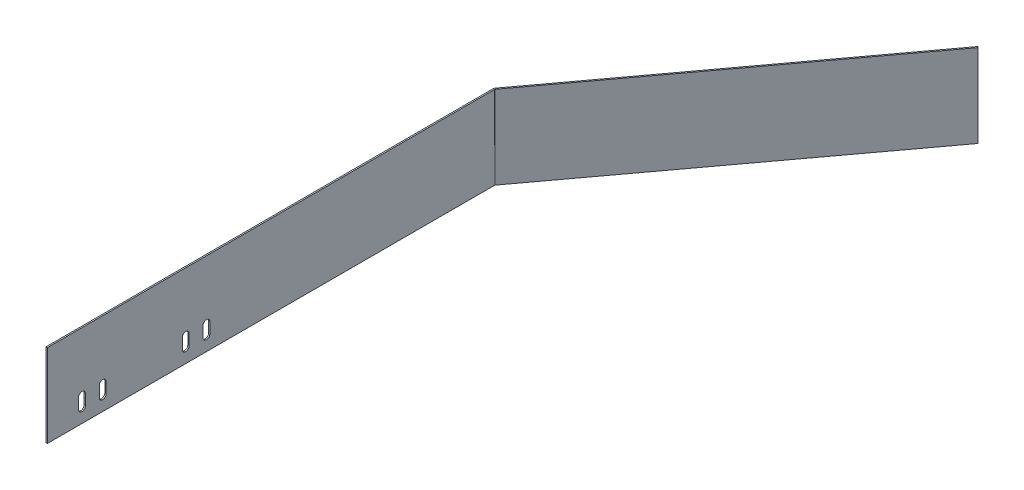
ISO-10303-21;
HEADER;
FILE_DESCRIPTION(('STEP AP214'),'2;1');
FILE_NAME('part.step','',(''),(''),'','','');
FILE_SCHEMA(('AUTOMOTIVE_DESIGN { 1 0 10303 214 1 1 1 1 }'));
ENDSEC;
DATA;
#1=APPLICATION_CONTEXT('core data for automotive mechanical design processes');
#2=APPLICATION_PROTOCOL_DEFINITION('international standard','automotive_design',2000,#1);
#3=PRODUCT_CONTEXT('',#1,'mechanical');
#4=PRODUCT('Part','Part','',(#3));
#5=PRODUCT_RELATED_PRODUCT_CATEGORY('part','',(#4));
#6=PRODUCT_DEFINITION_FORMATION('','',#4);
#7=PRODUCT_DEFINITION_CONTEXT('part definition',#1,'design');
#8=PRODUCT_DEFINITION('design','',#6,#7);
#9=PRODUCT_DEFINITION_SHAPE('','',#8);
#10=(LENGTH_UNIT() NAMED_UNIT(*) SI_UNIT(.MILLI.,.METRE.));
#11=(NAMED_UNIT(*) PLANE_ANGLE_UNIT() SI_UNIT($,.RADIAN.));
#12=(NAMED_UNIT(*) SI_UNIT($,.STERADIAN.) SOLID_ANGLE_UNIT());
#13=UNCERTAINTY_MEASURE_WITH_UNIT(LENGTH_MEASURE(1.E-05),#10,'distance_accuracy_value','');
#14=(GEOMETRIC_REPRESENTATION_CONTEXT(3) GLOBAL_UNCERTAINTY_ASSIGNED_CONTEXT((#13)) GLOBAL_UNIT_ASSIGNED_CONTEXT((#10,
#11,#12)) REPRESENTATION_CONTEXT('',''));
#15=CARTESIAN_POINT('',(0.,0.,0.));
#16=DIRECTION('',(0.,0.,1.));
#17=DIRECTION('',(1.,0.,0.));
#18=AXIS2_PLACEMENT_3D('',#15,#16,#17);
#19=CARTESIAN_POINT('',(2.,-60.,-325.));
#20=DIRECTION('',(0.,1.,0.));
#21=DIRECTION('',(0.,0.,1.));
#22=AXIS2_PLACEMENT_3D('',#19,#20,#21);
#23=PLANE('',#22);
#24=DIRECTION('',(-1.,0.,0.));
#25=VECTOR('',#24,1.);
#26=CARTESIAN_POINT('',(1.99999999999998,-60.,-320.978152935547));
#27=LINE('',#26,#25);
#28=CARTESIAN_POINT('',(2.,-60.,-320.978152935547));
#29=VERTEX_POINT('',#28);
#30=CARTESIAN_POINT('',(0.,-60.,-320.978152935547));
#31=VERTEX_POINT('',#30);
#32=EDGE_CURVE('E401',#29,#31,#27,.T.);
#33=ORIENTED_EDGE('',*,*,#32,.F.);
#34=DIRECTION('',(0.,0.,-1.));
#35=VECTOR('',#34,1.);
#36=CARTESIAN_POINT('',(2.,-60.,-325.));
#37=LINE('',#36,#35);
#38=CARTESIAN_POINT('',(2.,-60.,325.));
#39=VERTEX_POINT('',#38);
#40=EDGE_CURVE('E409',#39,#29,#37,.T.);
#41=ORIENTED_EDGE('',*,*,#40,.F.);
#42=DIRECTION('',(-1.,0.,0.));
#43=VECTOR('',#42,1.);
#44=CARTESIAN_POINT('',(2.,-60.,325.));
#45=LINE('',#44,#43);
#46=CARTESIAN_POINT('',(0.,-60.,325.));
#47=VERTEX_POINT('',#46);
#48=EDGE_CURVE('E13',#39,#47,#45,.T.);
#49=ORIENTED_EDGE('',*,*,#48,.T.);
#50=DIRECTION('',(0.,0.,-1.));
#51=VECTOR('',#50,1.);
#52=CARTESIAN_POINT('',(0.,-60.,-325.));
#53=LINE('',#52,#51);
#54=EDGE_CURVE('E417',#47,#31,#53,.T.);
#55=ORIENTED_EDGE('',*,*,#54,.T.);
#56=EDGE_LOOP('',(#33,#41,#49,#55));
#57=FACE_BOUND('',#56,.T.);
#58=ADVANCED_FACE('F58',(#57),#23,.F.);
#59=CARTESIAN_POINT('',(2.,60.,-325.));
#60=DIRECTION('',(0.,-1.,0.));
#61=DIRECTION('',(0.,0.,-1.));
#62=AXIS2_PLACEMENT_3D('',#59,#60,#61);
#63=PLANE('',#62);
#64=DIRECTION('',(-1.,0.,0.));
#65=VECTOR('',#64,1.);
#66=CARTESIAN_POINT('',(1.99999999999998,60.,-320.978152935547));
#67=LINE('',#66,#65);
#68=CARTESIAN_POINT('',(2.,60.,-320.978152935547));
#69=VERTEX_POINT('',#68);
#70=CARTESIAN_POINT('',(0.,60.,-320.978152935547));
#71=VERTEX_POINT('',#70);
#72=EDGE_CURVE('E390',#69,#71,#67,.T.);
#73=ORIENTED_EDGE('',*,*,#72,.T.);
#74=DIRECTION('',(0.,0.,1.));
#75=VECTOR('',#74,1.);
#76=CARTESIAN_POINT('',(0.,60.,-325.));
#77=LINE('',#76,#75);
#78=CARTESIAN_POINT('',(0.,60.,325.));
#79=VERTEX_POINT('',#78);
#80=EDGE_CURVE('E410',#71,#79,#77,.T.);
#81=ORIENTED_EDGE('',*,*,#80,.T.);
#82=DIRECTION('',(-1.,0.,0.));
#83=VECTOR('',#82,1.);
#84=CARTESIAN_POINT('',(2.,60.,325.));
#85=LINE('',#84,#83);
#86=CARTESIAN_POINT('',(2.,60.,325.));
#87=VERTEX_POINT('',#86);
#88=EDGE_CURVE('E66',#87,#79,#85,.T.);
#89=ORIENTED_EDGE('',*,*,#88,.F.);
#90=DIRECTION('',(0.,0.,1.));
#91=VECTOR('',#90,1.);
#92=CARTESIAN_POINT('',(2.,60.,-325.));
#93=LINE('',#92,#91);
#94=EDGE_CURVE('E413',#69,#87,#93,.T.);
#95=ORIENTED_EDGE('',*,*,#94,.F.);
#96=EDGE_LOOP('',(#73,#81,#89,#95));
#97=FACE_BOUND('',#96,.T.);
#98=ADVANCED_FACE('F435',(#97),#63,.F.);
#99=CARTESIAN_POINT('',(2.,0.,0.));
#100=DIRECTION('',(1.,0.,0.));
#101=DIRECTION('',(0.,0.,-1.));
#102=AXIS2_PLACEMENT_3D('',#99,#100,#101);
#103=PLANE('',#102);
#104=DIRECTION('',(0.,-1.,0.));
#105=VECTOR('',#104,1.);
#106=CARTESIAN_POINT('',(2.,-25.,270.));
#107=LINE('',#106,#105);
#108=CARTESIAN_POINT('',(2.,-25.,270.));
#109=VERTEX_POINT('',#108);
#110=CARTESIAN_POINT('',(2.,-40.,270.));
#111=VERTEX_POINT('',#110);
#112=EDGE_CURVE('E232',#109,#111,#107,.T.);
#113=ORIENTED_EDGE('',*,*,#112,.T.);
#114=CARTESIAN_POINT('',(2.,-40.,275.));
#115=DIRECTION('',(1.,0.,0.));
#116=DIRECTION('',(0.,0.,-1.));
#117=AXIS2_PLACEMENT_3D('',#114,#115,#116);
#118=CIRCLE('',#117,5.);
#119=CARTESIAN_POINT('',(2.,-40.,280.));
#120=VERTEX_POINT('',#119);
#121=EDGE_CURVE('E219',#111,#120,#118,.F.);
#122=ORIENTED_EDGE('',*,*,#121,.T.);
#123=DIRECTION('',(0.,1.,0.));
#124=VECTOR('',#123,1.);
#125=CARTESIAN_POINT('',(2.,-25.,280.));
#126=LINE('',#125,#124);
#127=CARTESIAN_POINT('',(2.,-25.,280.));
#128=VERTEX_POINT('',#127);
#129=EDGE_CURVE('E251',#120,#128,#126,.T.);
#130=ORIENTED_EDGE('',*,*,#129,.T.);
#131=CARTESIAN_POINT('',(2.,-25.,275.));
#132=DIRECTION('',(1.,0.,0.));
#133=DIRECTION('',(0.,0.,-1.));
#134=AXIS2_PLACEMENT_3D('',#131,#132,#133);
#135=CIRCLE('',#134,5.);
#136=EDGE_CURVE('E240',#128,#109,#135,.F.);
#137=ORIENTED_EDGE('',*,*,#136,.T.);
#138=EDGE_LOOP('',(#113,#122,#130,#137));
#139=FACE_BOUND('',#138,.T.);
#140=DIRECTION('',(0.,-1.,0.));
#141=VECTOR('',#140,1.);
#142=CARTESIAN_POINT('',(2.,-25.0000000000003,240.));
#143=LINE('',#142,#141);
#144=CARTESIAN_POINT('',(2.,-25.0000000000003,240.));
#145=VERTEX_POINT('',#144);
#146=CARTESIAN_POINT('',(2.,-40.0000000000002,240.));
#147=VERTEX_POINT('',#146);
#148=EDGE_CURVE('E260',#145,#147,#143,.T.);
#149=ORIENTED_EDGE('',*,*,#148,.T.);
#150=CARTESIAN_POINT('',(2.,-40.0000000000002,245.));
#151=DIRECTION('',(1.,0.,0.));
#152=DIRECTION('',(0.,0.,-1.));
#153=AXIS2_PLACEMENT_3D('',#150,#151,#152);
#154=CIRCLE('',#153,5.);
#155=CARTESIAN_POINT('',(2.,-40.0000000000002,250.));
#156=VERTEX_POINT('',#155);
#157=EDGE_CURVE('E281',#147,#156,#154,.F.);
#158=ORIENTED_EDGE('',*,*,#157,.T.);
#159=DIRECTION('',(0.,1.,0.));
#160=VECTOR('',#159,1.);
#161=CARTESIAN_POINT('',(2.,-25.0000000000002,250.));
#162=LINE('',#161,#160);
#163=CARTESIAN_POINT('',(2.,-25.0000000000002,250.));
#164=VERTEX_POINT('',#163);
#165=EDGE_CURVE('E277',#156,#164,#162,.T.);
#166=ORIENTED_EDGE('',*,*,#165,.T.);
#167=CARTESIAN_POINT('',(2.,-25.0000000000003,245.));
#168=DIRECTION('',(1.,0.,0.));
#169=DIRECTION('',(0.,0.,-1.));
#170=AXIS2_PLACEMENT_3D('',#167,#168,#169);
#171=CIRCLE('',#170,5.);
#172=EDGE_CURVE('E273',#164,#145,#171,.F.);
#173=ORIENTED_EDGE('',*,*,#172,.T.);
#174=EDGE_LOOP('',(#149,#158,#166,#173));
#175=FACE_BOUND('',#174,.T.);
#176=DIRECTION('',(0.,-1.,0.));
#177=VECTOR('',#176,1.);
#178=CARTESIAN_POINT('',(2.,-25.0000000000011,120.));
#179=LINE('',#178,#177);
#180=CARTESIAN_POINT('',(2.,-25.0000000000011,120.));
#181=VERTEX_POINT('',#180);
#182=CARTESIAN_POINT('',(2.,-40.0000000000011,120.));
#183=VERTEX_POINT('',#182);
#184=EDGE_CURVE('E291',#181,#183,#179,.T.);
#185=ORIENTED_EDGE('',*,*,#184,.T.);
#186=CARTESIAN_POINT('',(2.,-40.0000000000011,125.));
#187=DIRECTION('',(1.,0.,0.));
#188=DIRECTION('',(0.,0.,-1.));
#189=AXIS2_PLACEMENT_3D('',#186,#187,#188);
#190=CIRCLE('',#189,5.);
#191=CARTESIAN_POINT('',(2.,-40.0000000000011,130.));
#192=VERTEX_POINT('',#191);
#193=EDGE_CURVE('E313',#183,#192,#190,.F.);
#194=ORIENTED_EDGE('',*,*,#193,.T.);
#195=DIRECTION('',(0.,1.,0.));
#196=VECTOR('',#195,1.);
#197=CARTESIAN_POINT('',(2.,-25.0000000000011,130.));
#198=LINE('',#197,#196);
#199=CARTESIAN_POINT('',(2.,-25.0000000000011,130.));
#200=VERTEX_POINT('',#199);
#201=EDGE_CURVE('E309',#192,#200,#198,.T.);
#202=ORIENTED_EDGE('',*,*,#201,.T.);
#203=CARTESIAN_POINT('',(2.,-25.0000000000011,125.));
#204=DIRECTION('',(1.,0.,0.));
#205=DIRECTION('',(0.,0.,-1.));
#206=AXIS2_PLACEMENT_3D('',#203,#204,#205);
#207=CIRCLE('',#206,5.);
#208=EDGE_CURVE('E305',#200,#181,#207,.F.);
#209=ORIENTED_EDGE('',*,*,#208,.T.);
#210=EDGE_LOOP('',(#185,#194,#202,#209));
#211=FACE_BOUND('',#210,.T.);
#212=DIRECTION('',(0.,-1.,0.));
#213=VECTOR('',#212,1.);
#214=CARTESIAN_POINT('',(2.,-25.0000000000013,90.));
#215=LINE('',#214,#213);
#216=CARTESIAN_POINT('',(2.,-25.0000000000013,90.));
#217=VERTEX_POINT('',#216);
#218=CARTESIAN_POINT('',(2.,-40.0000000000013,90.));
#219=VERTEX_POINT('',#218);
#220=EDGE_CURVE('E323',#217,#219,#215,.T.);
#221=ORIENTED_EDGE('',*,*,#220,.T.);
#222=CARTESIAN_POINT('',(2.,-40.0000000000013,95.));
#223=DIRECTION('',(1.,0.,0.));
#224=DIRECTION('',(0.,0.,-1.));
#225=AXIS2_PLACEMENT_3D('',#222,#223,#224);
#226=CIRCLE('',#225,5.);
#227=CARTESIAN_POINT('',(2.,-40.0000000000013,100.));
#228=VERTEX_POINT('',#227);
#229=EDGE_CURVE('E344',#219,#228,#226,.F.);
#230=ORIENTED_EDGE('',*,*,#229,.T.);
#231=DIRECTION('',(0.,1.,0.));
#232=VECTOR('',#231,1.);
#233=CARTESIAN_POINT('',(2.,-25.0000000000013,100.));
#234=LINE('',#233,#232);
#235=CARTESIAN_POINT('',(2.,-25.0000000000013,100.));
#236=VERTEX_POINT('',#235);
#237=EDGE_CURVE('E340',#228,#236,#234,.T.);
#238=ORIENTED_EDGE('',*,*,#237,.T.);
#239=CARTESIAN_POINT('',(2.,-25.0000000000013,95.));
#240=DIRECTION('',(1.,0.,0.));
#241=DIRECTION('',(0.,0.,-1.));
#242=AXIS2_PLACEMENT_3D('',#239,#240,#241);
#243=CIRCLE('',#242,5.);
#244=EDGE_CURVE('E336',#236,#217,#243,.F.);
#245=ORIENTED_EDGE('',*,*,#244,.T.);
#246=EDGE_LOOP('',(#221,#230,#238,#245));
#247=FACE_BOUND('',#246,.T.);
#248=ORIENTED_EDGE('',*,*,#40,.T.);
#249=DIRECTION('',(0.,1.,0.));
#250=VECTOR('',#249,1.);
#251=CARTESIAN_POINT('',(1.99999999999998,60.,-320.978152935547));
#252=LINE('',#251,#250);
#253=EDGE_CURVE('E396',#69,#29,#252,.F.);
#254=ORIENTED_EDGE('',*,*,#253,.F.);
#255=ORIENTED_EDGE('',*,*,#94,.T.);
#256=DIRECTION('',(0.,-1.,0.));
#257=VECTOR('',#256,1.);
#258=CARTESIAN_POINT('',(2.,-60.,325.));
#259=LINE('',#258,#257);
#260=EDGE_CURVE('E406',#87,#39,#259,.T.);
#261=ORIENTED_EDGE('',*,*,#260,.T.);
#262=EDGE_LOOP('',(#248,#254,#255,#261));
#263=FACE_BOUND('',#262,.T.);
#264=ADVANCED_FACE('F238',(#139,#175,#211,#247,#263),#103,.T.);
#265=CARTESIAN_POINT('',(0.,0.,0.));
#266=DIRECTION('',(1.,0.,0.));
#267=DIRECTION('',(0.,0.,-1.));
#268=AXIS2_PLACEMENT_3D('',#265,#266,#267);
#269=PLANE('',#268);
#270=CARTESIAN_POINT('',(0.,-40.,275.));
#271=DIRECTION('',(-1.,0.,0.));
#272=DIRECTION('',(0.,0.,1.));
#273=AXIS2_PLACEMENT_3D('',#270,#271,#272);
#274=CIRCLE('',#273,5.);
#275=CARTESIAN_POINT('',(0.,-40.,270.));
#276=VERTEX_POINT('',#275);
#277=CARTESIAN_POINT('',(0.,-40.,280.));
#278=VERTEX_POINT('',#277);
#279=EDGE_CURVE('E243',#276,#278,#274,.T.);
#280=ORIENTED_EDGE('',*,*,#279,.F.);
#281=DIRECTION('',(0.,-1.,0.));
#282=VECTOR('',#281,1.);
#283=CARTESIAN_POINT('',(0.,-25.,270.));
#284=LINE('',#283,#282);
#285=CARTESIAN_POINT('',(0.,-25.,270.));
#286=VERTEX_POINT('',#285);
#287=EDGE_CURVE('E235',#286,#276,#284,.T.);
#288=ORIENTED_EDGE('',*,*,#287,.F.);
#289=CARTESIAN_POINT('',(0.,-25.,275.));
#290=DIRECTION('',(-1.,0.,0.));
#291=DIRECTION('',(0.,0.,1.));
#292=AXIS2_PLACEMENT_3D('',#289,#290,#291);
#293=CIRCLE('',#292,5.);
#294=CARTESIAN_POINT('',(0.,-25.,280.));
#295=VERTEX_POINT('',#294);
#296=EDGE_CURVE('E247',#295,#286,#293,.T.);
#297=ORIENTED_EDGE('',*,*,#296,.F.);
#298=DIRECTION('',(0.,1.,0.));
#299=VECTOR('',#298,1.);
#300=CARTESIAN_POINT('',(0.,-25.,280.));
#301=LINE('',#300,#299);
#302=EDGE_CURVE('E241',#278,#295,#301,.T.);
#303=ORIENTED_EDGE('',*,*,#302,.F.);
#304=EDGE_LOOP('',(#280,#288,#297,#303));
#305=FACE_BOUND('',#304,.T.);
#306=CARTESIAN_POINT('',(0.,-40.0000000000002,245.));
#307=DIRECTION('',(-1.,0.,0.));
#308=DIRECTION('',(0.,0.,1.));
#309=AXIS2_PLACEMENT_3D('',#306,#307,#308);
#310=CIRCLE('',#309,5.);
#311=CARTESIAN_POINT('',(0.,-40.0000000000002,240.));
#312=VERTEX_POINT('',#311);
#313=CARTESIAN_POINT('',(0.,-40.0000000000002,250.));
#314=VERTEX_POINT('',#313);
#315=EDGE_CURVE('E261',#312,#314,#310,.T.);
#316=ORIENTED_EDGE('',*,*,#315,.F.);
#317=DIRECTION('',(0.,-1.,0.));
#318=VECTOR('',#317,1.);
#319=CARTESIAN_POINT('',(0.,-25.0000000000003,240.));
#320=LINE('',#319,#318);
#321=CARTESIAN_POINT('',(0.,-25.0000000000003,240.));
#322=VERTEX_POINT('',#321);
#323=EDGE_CURVE('E264',#322,#312,#320,.T.);
#324=ORIENTED_EDGE('',*,*,#323,.F.);
#325=CARTESIAN_POINT('',(0.,-25.0000000000003,245.));
#326=DIRECTION('',(-1.,0.,0.));
#327=DIRECTION('',(0.,0.,1.));
#328=AXIS2_PLACEMENT_3D('',#325,#326,#327);
#329=CIRCLE('',#328,5.);
#330=CARTESIAN_POINT('',(0.,-25.0000000000002,250.));
#331=VERTEX_POINT('',#330);
#332=EDGE_CURVE('E267',#331,#322,#329,.T.);
#333=ORIENTED_EDGE('',*,*,#332,.F.);
#334=DIRECTION('',(0.,1.,0.));
#335=VECTOR('',#334,1.);
#336=CARTESIAN_POINT('',(0.,-25.0000000000002,250.));
#337=LINE('',#336,#335);
#338=EDGE_CURVE('E258',#314,#331,#337,.T.);
#339=ORIENTED_EDGE('',*,*,#338,.F.);
#340=EDGE_LOOP('',(#316,#324,#333,#339));
#341=FACE_BOUND('',#340,.T.);
#342=CARTESIAN_POINT('',(0.,-40.0000000000011,125.));
#343=DIRECTION('',(-1.,0.,0.));
#344=DIRECTION('',(0.,0.,1.));
#345=AXIS2_PLACEMENT_3D('',#342,#343,#344);
#346=CIRCLE('',#345,5.);
#347=CARTESIAN_POINT('',(0.,-40.0000000000011,120.));
#348=VERTEX_POINT('',#347);
#349=CARTESIAN_POINT('',(0.,-40.0000000000011,130.));
#350=VERTEX_POINT('',#349);
#351=EDGE_CURVE('E292',#348,#350,#346,.T.);
#352=ORIENTED_EDGE('',*,*,#351,.F.);
#353=DIRECTION('',(0.,-1.,0.));
#354=VECTOR('',#353,1.);
#355=CARTESIAN_POINT('',(0.,-25.0000000000011,120.));
#356=LINE('',#355,#354);
#357=CARTESIAN_POINT('',(0.,-25.0000000000011,120.));
#358=VERTEX_POINT('',#357);
#359=EDGE_CURVE('E295',#358,#348,#356,.T.);
#360=ORIENTED_EDGE('',*,*,#359,.F.);
#361=CARTESIAN_POINT('',(0.,-25.0000000000011,125.));
#362=DIRECTION('',(-1.,0.,0.));
#363=DIRECTION('',(0.,0.,1.));
#364=AXIS2_PLACEMENT_3D('',#361,#362,#363);
#365=CIRCLE('',#364,5.);
#366=CARTESIAN_POINT('',(0.,-25.0000000000011,130.));
#367=VERTEX_POINT('',#366);
#368=EDGE_CURVE('E298',#367,#358,#365,.T.);
#369=ORIENTED_EDGE('',*,*,#368,.F.);
#370=DIRECTION('',(0.,1.,0.));
#371=VECTOR('',#370,1.);
#372=CARTESIAN_POINT('',(0.,-25.0000000000011,130.));
#373=LINE('',#372,#371);
#374=EDGE_CURVE('E289',#350,#367,#373,.T.);
#375=ORIENTED_EDGE('',*,*,#374,.F.);
#376=EDGE_LOOP('',(#352,#360,#369,#375));
#377=FACE_BOUND('',#376,.T.);
#378=CARTESIAN_POINT('',(0.,-40.0000000000013,95.));
#379=DIRECTION('',(-1.,0.,0.));
#380=DIRECTION('',(0.,0.,1.));
#381=AXIS2_PLACEMENT_3D('',#378,#379,#380);
#382=CIRCLE('',#381,5.);
#383=CARTESIAN_POINT('',(0.,-40.0000000000013,90.));
#384=VERTEX_POINT('',#383);
#385=CARTESIAN_POINT('',(0.,-40.0000000000013,100.));
#386=VERTEX_POINT('',#385);
#387=EDGE_CURVE('E324',#384,#386,#382,.T.);
#388=ORIENTED_EDGE('',*,*,#387,.F.);
#389=DIRECTION('',(0.,-1.,0.));
#390=VECTOR('',#389,1.);
#391=CARTESIAN_POINT('',(0.,-25.0000000000013,90.));
#392=LINE('',#391,#390);
#393=CARTESIAN_POINT('',(0.,-25.0000000000013,90.));
#394=VERTEX_POINT('',#393);
#395=EDGE_CURVE('E327',#394,#384,#392,.T.);
#396=ORIENTED_EDGE('',*,*,#395,.F.);
#397=CARTESIAN_POINT('',(0.,-25.0000000000013,95.));
#398=DIRECTION('',(-1.,0.,0.));
#399=DIRECTION('',(0.,0.,1.));
#400=AXIS2_PLACEMENT_3D('',#397,#398,#399);
#401=CIRCLE('',#400,5.);
#402=CARTESIAN_POINT('',(0.,-25.0000000000013,100.));
#403=VERTEX_POINT('',#402);
#404=EDGE_CURVE('E330',#403,#394,#401,.T.);
#405=ORIENTED_EDGE('',*,*,#404,.F.);
#406=DIRECTION('',(0.,1.,0.));
#407=VECTOR('',#406,1.);
#408=CARTESIAN_POINT('',(0.,-25.0000000000013,100.));
#409=LINE('',#408,#407);
#410=EDGE_CURVE('E321',#386,#403,#409,.T.);
#411=ORIENTED_EDGE('',*,*,#410,.F.);
#412=EDGE_LOOP('',(#388,#396,#405,#411));
#413=FACE_BOUND('',#412,.T.);
#414=DIRECTION('',(0.,1.,0.));
#415=VECTOR('',#414,1.);
#416=CARTESIAN_POINT('',(0.,60.,-320.978152935547));
#417=LINE('',#416,#415);
#418=EDGE_CURVE('E384',#71,#31,#417,.F.);
#419=ORIENTED_EDGE('',*,*,#418,.T.);
#420=ORIENTED_EDGE('',*,*,#54,.F.);
#421=DIRECTION('',(0.,-1.,0.));
#422=VECTOR('',#421,1.);
#423=CARTESIAN_POINT('',(0.,-60.,325.));
#424=LINE('',#423,#422);
#425=EDGE_CURVE('E404',#79,#47,#424,.T.);
#426=ORIENTED_EDGE('',*,*,#425,.F.);
#427=ORIENTED_EDGE('',*,*,#80,.F.);
#428=EDGE_LOOP('',(#419,#420,#426,#427));
#429=FACE_BOUND('',#428,.T.);
#430=ADVANCED_FACE('F430',(#305,#341,#377,#413,#429),#269,.F.);
#431=CARTESIAN_POINT('',(2.,-60.,325.));
#432=DIRECTION('',(0.,0.,-1.));
#433=DIRECTION('',(-1.,0.,0.));
#434=AXIS2_PLACEMENT_3D('',#431,#432,#433);
#435=PLANE('',#434);
#436=ORIENTED_EDGE('',*,*,#425,.T.);
#437=ORIENTED_EDGE('',*,*,#48,.F.);
#438=ORIENTED_EDGE('',*,*,#260,.F.);
#439=ORIENTED_EDGE('',*,*,#88,.T.);
#440=EDGE_LOOP('',(#436,#437,#438,#439));
#441=FACE_BOUND('',#440,.T.);
#442=ADVANCED_FACE('F60',(#441),#435,.F.);
#443=CARTESIAN_POINT('',(3.9999999999999,-60.,-320.978152935547));
#444=DIRECTION('',(0.,-1.,0.));
#445=DIRECTION('',(0.,0.,-1.));
#446=AXIS2_PLACEMENT_3D('',#443,#444,#445);
#447=PLANE('',#446);
#448=DIRECTION('',(-0.803856860617221,0.,-0.594822786751336));
#449=VECTOR('',#448,1.);
#450=CARTESIAN_POINT('',(0.784572557531282,-60.,-323.357444082552));
#451=LINE('',#450,#449);
#452=CARTESIAN_POINT('',(2.39228627876552,-60.,-322.16779850905));
#453=VERTEX_POINT('',#452);
#454=CARTESIAN_POINT('',(0.784572557531055,-60.,-323.357444082552));
#455=VERTEX_POINT('',#454);
#456=EDGE_CURVE('E257',#453,#455,#451,.T.);
#457=ORIENTED_EDGE('',*,*,#456,.F.);
#458=CARTESIAN_POINT('',(3.9999999999999,-60.,-320.978152935547));
#459=DIRECTION('',(0.,1.,0.));
#460=DIRECTION('',(0.,0.,1.));
#461=AXIS2_PLACEMENT_3D('',#458,#459,#460);
#462=CIRCLE('',#461,1.99999999999991);
#463=EDGE_CURVE('E393',#29,#453,#462,.F.);
#464=ORIENTED_EDGE('',*,*,#463,.F.);
#465=ORIENTED_EDGE('',*,*,#32,.T.);
#466=CARTESIAN_POINT('',(3.9999999999999,-60.,-320.978152935547));
#467=DIRECTION('',(0.,1.,0.));
#468=DIRECTION('',(0.,0.,1.));
#469=AXIS2_PLACEMENT_3D('',#466,#467,#468);
#470=CIRCLE('',#469,3.99999999999992);
#471=EDGE_CURVE('E386',#31,#455,#470,.F.);
#472=ORIENTED_EDGE('',*,*,#471,.T.);
#473=EDGE_LOOP('',(#457,#464,#465,#472));
#474=FACE_BOUND('',#473,.T.);
#475=ADVANCED_FACE('F465',(#474),#447,.T.);
#476=CARTESIAN_POINT('',(3.9999999999999,60.,-320.978152935547));
#477=DIRECTION('',(0.,-1.,0.));
#478=DIRECTION('',(0.,0.,-1.));
#479=AXIS2_PLACEMENT_3D('',#476,#477,#478);
#480=PLANE('',#479);
#481=CARTESIAN_POINT('',(3.9999999999999,60.,-320.978152935547));
#482=DIRECTION('',(0.,1.,0.));
#483=DIRECTION('',(0.,0.,1.));
#484=AXIS2_PLACEMENT_3D('',#481,#482,#483);
#485=CIRCLE('',#484,1.99999999999991);
#486=CARTESIAN_POINT('',(2.39228627876552,60.,-322.16779850905));
#487=VERTEX_POINT('',#486);
#488=EDGE_CURVE('E354',#487,#69,#485,.T.);
#489=ORIENTED_EDGE('',*,*,#488,.F.);
#490=DIRECTION('',(-0.803856860617221,0.,-0.594822786751336));
#491=VECTOR('',#490,1.);
#492=CARTESIAN_POINT('',(2.39228627876556,60.,-322.16779850905));
#493=LINE('',#492,#491);
#494=CARTESIAN_POINT('',(0.784572557531111,60.,-323.357444082552));
#495=VERTEX_POINT('',#494);
#496=EDGE_CURVE('E377',#487,#495,#493,.T.);
#497=ORIENTED_EDGE('',*,*,#496,.T.);
#498=CARTESIAN_POINT('',(3.9999999999999,60.,-320.978152935547));
#499=DIRECTION('',(0.,1.,0.));
#500=DIRECTION('',(0.,0.,1.));
#501=AXIS2_PLACEMENT_3D('',#498,#499,#500);
#502=CIRCLE('',#501,3.99999999999992);
#503=EDGE_CURVE('E387',#495,#71,#502,.T.);
#504=ORIENTED_EDGE('',*,*,#503,.T.);
#505=ORIENTED_EDGE('',*,*,#72,.F.);
#506=EDGE_LOOP('',(#489,#497,#504,#505));
#507=FACE_BOUND('',#506,.T.);
#508=ADVANCED_FACE('F438',(#507),#480,.F.);
#509=CARTESIAN_POINT('',(3.9999999999999,60.,-320.978152935547));
#510=DIRECTION('',(0.,1.,0.));
#511=DIRECTION('',(-0.803856860617221,0.,-0.594822786751337));
#512=AXIS2_PLACEMENT_3D('',#509,#510,#511);
#513=CYLINDRICAL_SURFACE('',#512,3.99999999999992);
#514=ORIENTED_EDGE('',*,*,#418,.F.);
#515=ORIENTED_EDGE('',*,*,#503,.F.);
#516=DIRECTION('',(0.,1.,0.));
#517=VECTOR('',#516,1.);
#518=CARTESIAN_POINT('',(0.784572557531088,0.,-323.357444082552));
#519=LINE('',#518,#517);
#520=EDGE_CURVE('E374',#455,#495,#519,.T.);
#521=ORIENTED_EDGE('',*,*,#520,.F.);
#522=ORIENTED_EDGE('',*,*,#471,.F.);
#523=EDGE_LOOP('',(#514,#515,#521,#522));
#524=FACE_BOUND('',#523,.T.);
#525=ADVANCED_FACE('F463',(#524),#513,.T.);
#526=CARTESIAN_POINT('',(3.9999999999999,60.,-320.978152935547));
#527=DIRECTION('',(0.,1.,0.));
#528=DIRECTION('',(-0.803856860617221,0.,-0.594822786751337));
#529=AXIS2_PLACEMENT_3D('',#526,#527,#528);
#530=CYLINDRICAL_SURFACE('',#529,1.99999999999991);
#531=ORIENTED_EDGE('',*,*,#253,.T.);
#532=ORIENTED_EDGE('',*,*,#463,.T.);
#533=DIRECTION('',(0.,-1.,0.));
#534=VECTOR('',#533,1.);
#535=CARTESIAN_POINT('',(2.39228627876556,-60.,-322.16779850905));
#536=LINE('',#535,#534);
#537=EDGE_CURVE('E380',#453,#487,#536,.F.);
#538=ORIENTED_EDGE('',*,*,#537,.T.);
#539=ORIENTED_EDGE('',*,*,#488,.T.);
#540=EDGE_LOOP('',(#531,#532,#538,#539));
#541=FACE_BOUND('',#540,.T.);
#542=ADVANCED_FACE('F440',(#541),#530,.F.);
#543=CARTESIAN_POINT('',(0.39228627876556,60.,-322.82729960333));
#544=DIRECTION('',(0.,1.,0.));
#545=DIRECTION('',(0.,0.,1.));
#546=AXIS2_PLACEMENT_3D('',#543,#544,#545);
#547=PLANE('',#546);
#548=DIRECTION('',(-0.594822786751337,0.,0.803856860617221));
#549=VECTOR('',#548,1.);
#550=CARTESIAN_POINT('',(0.39228627876556,60.,-322.82729960333));
#551=LINE('',#550,#549);
#552=CARTESIAN_POINT('',(297.411393375668,60.,-724.225585432719));
#553=VERTEX_POINT('',#552);
#554=EDGE_CURVE('E358',#553,#495,#551,.T.);
#555=ORIENTED_EDGE('',*,*,#554,.T.);
#556=ORIENTED_EDGE('',*,*,#496,.F.);
#557=DIRECTION('',(0.594822786751337,0.,-0.803856860617221));
#558=VECTOR('',#557,1.);
#559=CARTESIAN_POINT('',(-154.10715113927,60.,-110.670947256418));
#560=LINE('',#559,#558);
#561=CARTESIAN_POINT('',(299.019107096903,60.,-723.035939859216));
#562=VERTEX_POINT('',#561);
#563=EDGE_CURVE('E366',#562,#487,#560,.F.);
#564=ORIENTED_EDGE('',*,*,#563,.F.);
#565=DIRECTION('',(0.803856860617221,0.,0.594822786751337));
#566=VECTOR('',#565,1.);
#567=CARTESIAN_POINT('',(297.411393375668,60.,-724.225585432719));
#568=LINE('',#567,#566);
#569=EDGE_CURVE('E352',#553,#562,#568,.T.);
#570=ORIENTED_EDGE('',*,*,#569,.F.);
#571=EDGE_LOOP('',(#555,#556,#564,#570));
#572=FACE_BOUND('',#571,.T.);
#573=ADVANCED_FACE('F457',(#572),#547,.T.);
#574=CARTESIAN_POINT('',(297.411393375668,-60.,-724.225585432719));
#575=DIRECTION('',(0.,-1.,0.));
#576=DIRECTION('',(0.,0.,-1.));
#577=AXIS2_PLACEMENT_3D('',#574,#575,#576);
#578=PLANE('',#577);
#579=DIRECTION('',(-0.594822786751337,0.,0.803856860617221));
#580=VECTOR('',#579,1.);
#581=CARTESIAN_POINT('',(-154.10715113927,-60.,-110.670947256418));
#582=LINE('',#581,#580);
#583=CARTESIAN_POINT('',(299.019107096903,-60.,-723.035939859216));
#584=VERTEX_POINT('',#583);
#585=EDGE_CURVE('E372',#453,#584,#582,.F.);
#586=ORIENTED_EDGE('',*,*,#585,.F.);
#587=ORIENTED_EDGE('',*,*,#456,.T.);
#588=DIRECTION('',(0.594822786751337,0.,-0.803856860617221));
#589=VECTOR('',#588,1.);
#590=CARTESIAN_POINT('',(297.411393375668,-60.,-724.225585432719));
#591=LINE('',#590,#589);
#592=CARTESIAN_POINT('',(297.411393375668,-60.,-724.225585432719));
#593=VERTEX_POINT('',#592);
#594=EDGE_CURVE('E364',#455,#593,#591,.T.);
#595=ORIENTED_EDGE('',*,*,#594,.T.);
#596=DIRECTION('',(0.803856860617221,0.,0.594822786751337));
#597=VECTOR('',#596,1.);
#598=CARTESIAN_POINT('',(297.411393375668,-60.,-724.225585432719));
#599=LINE('',#598,#597);
#600=EDGE_CURVE('E355',#593,#584,#599,.T.);
#601=ORIENTED_EDGE('',*,*,#600,.T.);
#602=EDGE_LOOP('',(#586,#587,#595,#601));
#603=FACE_BOUND('',#602,.T.);
#604=ADVANCED_FACE('F449',(#603),#578,.T.);
#605=CARTESIAN_POINT('',(-155.714864860504,0.,-111.860592829921));
#606=DIRECTION('',(-0.803856860617221,0.,-0.594822786751337));
#607=DIRECTION('',(-0.594822786751337,0.,0.803856860617221));
#608=AXIS2_PLACEMENT_3D('',#605,#606,#607);
#609=PLANE('',#608);
#610=ORIENTED_EDGE('',*,*,#594,.F.);
#611=ORIENTED_EDGE('',*,*,#520,.T.);
#612=ORIENTED_EDGE('',*,*,#554,.F.);
#613=DIRECTION('',(0.,1.,0.));
#614=VECTOR('',#613,1.);
#615=CARTESIAN_POINT('',(297.411393375668,60.,-724.225585432719));
#616=LINE('',#615,#614);
#617=EDGE_CURVE('E361',#593,#553,#616,.T.);
#618=ORIENTED_EDGE('',*,*,#617,.F.);
#619=EDGE_LOOP('',(#610,#611,#612,#618));
#620=FACE_BOUND('',#619,.T.);
#621=ADVANCED_FACE('F460',(#620),#609,.T.);
#622=CARTESIAN_POINT('',(-154.10715113927,0.,-110.670947256418));
#623=DIRECTION('',(-0.803856860617221,0.,-0.594822786751337));
#624=DIRECTION('',(-0.594822786751337,0.,0.803856860617221));
#625=AXIS2_PLACEMENT_3D('',#622,#623,#624);
#626=PLANE('',#625);
#627=ORIENTED_EDGE('',*,*,#537,.F.);
#628=ORIENTED_EDGE('',*,*,#585,.T.);
#629=DIRECTION('',(0.,-1.,0.));
#630=VECTOR('',#629,1.);
#631=CARTESIAN_POINT('',(299.019107096903,0.,-723.035939859216));
#632=LINE('',#631,#630);
#633=EDGE_CURVE('E369',#584,#562,#632,.F.);
#634=ORIENTED_EDGE('',*,*,#633,.T.);
#635=ORIENTED_EDGE('',*,*,#563,.T.);
#636=EDGE_LOOP('',(#627,#628,#634,#635));
#637=FACE_BOUND('',#636,.T.);
#638=ADVANCED_FACE('F445',(#637),#626,.F.);
#639=CARTESIAN_POINT('',(297.411393375668,60.,-724.225585432719));
#640=DIRECTION('',(0.594822786751337,0.,-0.803856860617221));
#641=DIRECTION('',(-0.803856860617221,0.,-0.594822786751337));
#642=AXIS2_PLACEMENT_3D('',#639,#640,#641);
#643=PLANE('',#642);
#644=ORIENTED_EDGE('',*,*,#633,.F.);
#645=ORIENTED_EDGE('',*,*,#600,.F.);
#646=ORIENTED_EDGE('',*,*,#617,.T.);
#647=ORIENTED_EDGE('',*,*,#569,.T.);
#648=EDGE_LOOP('',(#644,#645,#646,#647));
#649=FACE_BOUND('',#648,.T.);
#650=ADVANCED_FACE('F455',(#649),#643,.T.);
#651=CARTESIAN_POINT('',(28.9258240356725,-25.0000000000013,90.));
#652=DIRECTION('',(0.,0.,-1.));
#653=DIRECTION('',(-1.,0.,0.));
#654=AXIS2_PLACEMENT_3D('',#651,#652,#653);
#655=PLANE('',#654);
#656=DIRECTION('',(-1.,0.,0.));
#657=VECTOR('',#656,1.);
#658=CARTESIAN_POINT('',(28.9258240356725,-25.0000000000013,90.));
#659=LINE('',#658,#657);
#660=EDGE_CURVE('E301',#217,#394,#659,.T.);
#661=ORIENTED_EDGE('',*,*,#660,.T.);
#662=ORIENTED_EDGE('',*,*,#395,.T.);
#663=DIRECTION('',(-1.,0.,0.));
#664=VECTOR('',#663,1.);
#665=CARTESIAN_POINT('',(28.9258240356725,-40.0000000000013,90.));
#666=LINE('',#665,#664);
#667=EDGE_CURVE('E335',#219,#384,#666,.T.);
#668=ORIENTED_EDGE('',*,*,#667,.F.);
#669=ORIENTED_EDGE('',*,*,#220,.F.);
#670=EDGE_LOOP('',(#661,#662,#668,#669));
#671=FACE_BOUND('',#670,.T.);
#672=ADVANCED_FACE('F498',(#671),#655,.F.);
#673=CARTESIAN_POINT('',(28.9258240356725,-40.0000000000013,95.));
#674=DIRECTION('',(-1.,0.,0.));
#675=DIRECTION('',(0.,0.,1.));
#676=AXIS2_PLACEMENT_3D('',#673,#674,#675);
#677=CYLINDRICAL_SURFACE('',#676,5.);
#678=ORIENTED_EDGE('',*,*,#667,.T.);
#679=ORIENTED_EDGE('',*,*,#387,.T.);
#680=DIRECTION('',(-1.,0.,0.));
#681=VECTOR('',#680,1.);
#682=CARTESIAN_POINT('',(28.9258240356725,-40.0000000000013,100.));
#683=LINE('',#682,#681);
#684=EDGE_CURVE('E343',#228,#386,#683,.T.);
#685=ORIENTED_EDGE('',*,*,#684,.F.);
#686=ORIENTED_EDGE('',*,*,#229,.F.);
#687=EDGE_LOOP('',(#678,#679,#685,#686));
#688=FACE_BOUND('',#687,.T.);
#689=ADVANCED_FACE('F503',(#688),#677,.F.);
#690=CARTESIAN_POINT('',(28.9258240356725,-25.0000000000013,100.));
#691=DIRECTION('',(0.,0.,1.));
#692=DIRECTION('',(1.,0.,0.));
#693=AXIS2_PLACEMENT_3D('',#690,#691,#692);
#694=PLANE('',#693);
#695=ORIENTED_EDGE('',*,*,#684,.T.);
#696=ORIENTED_EDGE('',*,*,#410,.T.);
#697=DIRECTION('',(-1.,0.,0.));
#698=VECTOR('',#697,1.);
#699=CARTESIAN_POINT('',(28.9258240356725,-25.0000000000013,100.));
#700=LINE('',#699,#698);
#701=EDGE_CURVE('E339',#236,#403,#700,.T.);
#702=ORIENTED_EDGE('',*,*,#701,.F.);
#703=ORIENTED_EDGE('',*,*,#237,.F.);
#704=EDGE_LOOP('',(#695,#696,#702,#703));
#705=FACE_BOUND('',#704,.T.);
#706=ADVANCED_FACE('F514',(#705),#694,.F.);
#707=CARTESIAN_POINT('',(28.9258240356725,-25.0000000000013,95.));
#708=DIRECTION('',(-1.,0.,0.));
#709=DIRECTION('',(0.,0.,1.));
#710=AXIS2_PLACEMENT_3D('',#707,#708,#709);
#711=CYLINDRICAL_SURFACE('',#710,5.);
#712=ORIENTED_EDGE('',*,*,#701,.T.);
#713=ORIENTED_EDGE('',*,*,#404,.T.);
#714=ORIENTED_EDGE('',*,*,#660,.F.);
#715=ORIENTED_EDGE('',*,*,#244,.F.);
#716=EDGE_LOOP('',(#712,#713,#714,#715));
#717=FACE_BOUND('',#716,.T.);
#718=ADVANCED_FACE('F525',(#717),#711,.F.);
#719=CARTESIAN_POINT('',(28.9258240356725,-25.0000000000011,120.));
#720=DIRECTION('',(0.,0.,-1.));
#721=DIRECTION('',(-1.,0.,0.));
#722=AXIS2_PLACEMENT_3D('',#719,#720,#721);
#723=PLANE('',#722);
#724=DIRECTION('',(-1.,0.,0.));
#725=VECTOR('',#724,1.);
#726=CARTESIAN_POINT('',(28.9258240356725,-25.0000000000011,120.));
#727=LINE('',#726,#725);
#728=EDGE_CURVE('E269',#181,#358,#727,.T.);
#729=ORIENTED_EDGE('',*,*,#728,.T.);
#730=ORIENTED_EDGE('',*,*,#359,.T.);
#731=DIRECTION('',(-1.,0.,0.));
#732=VECTOR('',#731,1.);
#733=CARTESIAN_POINT('',(28.9258240356725,-40.0000000000011,120.));
#734=LINE('',#733,#732);
#735=EDGE_CURVE('E304',#183,#348,#734,.T.);
#736=ORIENTED_EDGE('',*,*,#735,.F.);
#737=ORIENTED_EDGE('',*,*,#184,.F.);
#738=EDGE_LOOP('',(#729,#730,#736,#737));
#739=FACE_BOUND('',#738,.T.);
#740=ADVANCED_FACE('F536',(#739),#723,.F.);
#741=CARTESIAN_POINT('',(28.9258240356725,-40.0000000000011,125.));
#742=DIRECTION('',(-1.,0.,0.));
#743=DIRECTION('',(0.,0.,1.));
#744=AXIS2_PLACEMENT_3D('',#741,#742,#743);
#745=CYLINDRICAL_SURFACE('',#744,5.);
#746=ORIENTED_EDGE('',*,*,#735,.T.);
#747=ORIENTED_EDGE('',*,*,#351,.T.);
#748=DIRECTION('',(-1.,0.,0.));
#749=VECTOR('',#748,1.);
#750=CARTESIAN_POINT('',(28.9258240356725,-40.0000000000011,130.));
#751=LINE('',#750,#749);
#752=EDGE_CURVE('E312',#192,#350,#751,.T.);
#753=ORIENTED_EDGE('',*,*,#752,.F.);
#754=ORIENTED_EDGE('',*,*,#193,.F.);
#755=EDGE_LOOP('',(#746,#747,#753,#754));
#756=FACE_BOUND('',#755,.T.);
#757=ADVANCED_FACE('F547',(#756),#745,.F.);
#758=CARTESIAN_POINT('',(28.9258240356725,-25.0000000000011,130.));
#759=DIRECTION('',(0.,0.,1.));
#760=DIRECTION('',(1.,0.,0.));
#761=AXIS2_PLACEMENT_3D('',#758,#759,#760);
#762=PLANE('',#761);
#763=ORIENTED_EDGE('',*,*,#752,.T.);
#764=ORIENTED_EDGE('',*,*,#374,.T.);
#765=DIRECTION('',(-1.,0.,0.));
#766=VECTOR('',#765,1.);
#767=CARTESIAN_POINT('',(28.9258240356725,-25.0000000000011,130.));
#768=LINE('',#767,#766);
#769=EDGE_CURVE('E308',#200,#367,#768,.T.);
#770=ORIENTED_EDGE('',*,*,#769,.F.);
#771=ORIENTED_EDGE('',*,*,#201,.F.);
#772=EDGE_LOOP('',(#763,#764,#770,#771));
#773=FACE_BOUND('',#772,.T.);
#774=ADVANCED_FACE('F558',(#773),#762,.F.);
#775=CARTESIAN_POINT('',(28.9258240356725,-25.0000000000011,125.));
#776=DIRECTION('',(-1.,0.,0.));
#777=DIRECTION('',(0.,0.,1.));
#778=AXIS2_PLACEMENT_3D('',#775,#776,#777);
#779=CYLINDRICAL_SURFACE('',#778,5.);
#780=ORIENTED_EDGE('',*,*,#769,.T.);
#781=ORIENTED_EDGE('',*,*,#368,.T.);
#782=ORIENTED_EDGE('',*,*,#728,.F.);
#783=ORIENTED_EDGE('',*,*,#208,.F.);
#784=EDGE_LOOP('',(#780,#781,#782,#783));
#785=FACE_BOUND('',#784,.T.);
#786=ADVANCED_FACE('F569',(#785),#779,.F.);
#787=CARTESIAN_POINT('',(28.9258240356725,-25.0000000000003,240.));
#788=DIRECTION('',(0.,0.,-1.));
#789=DIRECTION('',(-1.,0.,0.));
#790=AXIS2_PLACEMENT_3D('',#787,#788,#789);
#791=PLANE('',#790);
#792=DIRECTION('',(-1.,0.,0.));
#793=VECTOR('',#792,1.);
#794=CARTESIAN_POINT('',(28.9258240356725,-25.0000000000003,240.));
#795=LINE('',#794,#793);
#796=EDGE_CURVE('E81',#145,#322,#795,.T.);
#797=ORIENTED_EDGE('',*,*,#796,.T.);
#798=ORIENTED_EDGE('',*,*,#323,.T.);
#799=DIRECTION('',(-1.,0.,0.));
#800=VECTOR('',#799,1.);
#801=CARTESIAN_POINT('',(28.9258240356725,-40.0000000000002,240.));
#802=LINE('',#801,#800);
#803=EDGE_CURVE('E272',#147,#312,#802,.T.);
#804=ORIENTED_EDGE('',*,*,#803,.F.);
#805=ORIENTED_EDGE('',*,*,#148,.F.);
#806=EDGE_LOOP('',(#797,#798,#804,#805));
#807=FACE_BOUND('',#806,.T.);
#808=ADVANCED_FACE('F580',(#807),#791,.F.);
#809=CARTESIAN_POINT('',(28.9258240356725,-40.0000000000002,245.));
#810=DIRECTION('',(-1.,0.,0.));
#811=DIRECTION('',(0.,0.,1.));
#812=AXIS2_PLACEMENT_3D('',#809,#810,#811);
#813=CYLINDRICAL_SURFACE('',#812,5.);
#814=ORIENTED_EDGE('',*,*,#803,.T.);
#815=ORIENTED_EDGE('',*,*,#315,.T.);
#816=DIRECTION('',(-1.,0.,0.));
#817=VECTOR('',#816,1.);
#818=CARTESIAN_POINT('',(28.9258240356725,-40.0000000000002,250.));
#819=LINE('',#818,#817);
#820=EDGE_CURVE('E280',#156,#314,#819,.T.);
#821=ORIENTED_EDGE('',*,*,#820,.F.);
#822=ORIENTED_EDGE('',*,*,#157,.F.);
#823=EDGE_LOOP('',(#814,#815,#821,#822));
#824=FACE_BOUND('',#823,.T.);
#825=ADVANCED_FACE('F591',(#824),#813,.F.);
#826=CARTESIAN_POINT('',(28.9258240356725,-25.0000000000002,250.));
#827=DIRECTION('',(0.,0.,1.));
#828=DIRECTION('',(1.,0.,0.));
#829=AXIS2_PLACEMENT_3D('',#826,#827,#828);
#830=PLANE('',#829);
#831=ORIENTED_EDGE('',*,*,#820,.T.);
#832=ORIENTED_EDGE('',*,*,#338,.T.);
#833=DIRECTION('',(-1.,0.,0.));
#834=VECTOR('',#833,1.);
#835=CARTESIAN_POINT('',(28.9258240356725,-25.0000000000002,250.));
#836=LINE('',#835,#834);
#837=EDGE_CURVE('E276',#164,#331,#836,.T.);
#838=ORIENTED_EDGE('',*,*,#837,.F.);
#839=ORIENTED_EDGE('',*,*,#165,.F.);
#840=EDGE_LOOP('',(#831,#832,#838,#839));
#841=FACE_BOUND('',#840,.T.);
#842=ADVANCED_FACE('F602',(#841),#830,.F.);
#843=CARTESIAN_POINT('',(28.9258240356725,-25.0000000000003,245.));
#844=DIRECTION('',(-1.,0.,0.));
#845=DIRECTION('',(0.,0.,1.));
#846=AXIS2_PLACEMENT_3D('',#843,#844,#845);
#847=CYLINDRICAL_SURFACE('',#846,5.);
#848=ORIENTED_EDGE('',*,*,#837,.T.);
#849=ORIENTED_EDGE('',*,*,#332,.T.);
#850=ORIENTED_EDGE('',*,*,#796,.F.);
#851=ORIENTED_EDGE('',*,*,#172,.F.);
#852=EDGE_LOOP('',(#848,#849,#850,#851));
#853=FACE_BOUND('',#852,.T.);
#854=ADVANCED_FACE('F613',(#853),#847,.F.);
#855=CARTESIAN_POINT('',(28.9258240356725,-25.,270.));
#856=DIRECTION('',(0.,0.,-1.));
#857=DIRECTION('',(-1.,0.,0.));
#858=AXIS2_PLACEMENT_3D('',#855,#856,#857);
#859=PLANE('',#858);
#860=DIRECTION('',(-1.,0.,0.));
#861=VECTOR('',#860,1.);
#862=CARTESIAN_POINT('',(28.9258240356725,-25.,270.));
#863=LINE('',#862,#861);
#864=EDGE_CURVE('E73',#109,#286,#863,.T.);
#865=ORIENTED_EDGE('',*,*,#864,.T.);
#866=ORIENTED_EDGE('',*,*,#287,.T.);
#867=DIRECTION('',(-1.,0.,0.));
#868=VECTOR('',#867,1.);
#869=CARTESIAN_POINT('',(28.9258240356725,-40.,270.));
#870=LINE('',#869,#868);
#871=EDGE_CURVE('E223',#111,#276,#870,.T.);
#872=ORIENTED_EDGE('',*,*,#871,.F.);
#873=ORIENTED_EDGE('',*,*,#112,.F.);
#874=EDGE_LOOP('',(#865,#866,#872,#873));
#875=FACE_BOUND('',#874,.T.);
#876=ADVANCED_FACE('F231',(#875),#859,.F.);
#877=CARTESIAN_POINT('',(28.9258240356725,-40.,275.));
#878=DIRECTION('',(-1.,0.,0.));
#879=DIRECTION('',(0.,0.,1.));
#880=AXIS2_PLACEMENT_3D('',#877,#878,#879);
#881=CYLINDRICAL_SURFACE('',#880,5.);
#882=ORIENTED_EDGE('',*,*,#871,.T.);
#883=ORIENTED_EDGE('',*,*,#279,.T.);
#884=DIRECTION('',(-1.,0.,0.));
#885=VECTOR('',#884,1.);
#886=CARTESIAN_POINT('',(28.9258240356725,-40.,280.));
#887=LINE('',#886,#885);
#888=EDGE_CURVE('E225',#120,#278,#887,.T.);
#889=ORIENTED_EDGE('',*,*,#888,.F.);
#890=ORIENTED_EDGE('',*,*,#121,.F.);
#891=EDGE_LOOP('',(#882,#883,#889,#890));
#892=FACE_BOUND('',#891,.T.);
#893=ADVANCED_FACE('F221',(#892),#881,.F.);
#894=CARTESIAN_POINT('',(28.9258240356725,-25.,280.));
#895=DIRECTION('',(0.,0.,1.));
#896=DIRECTION('',(1.,0.,0.));
#897=AXIS2_PLACEMENT_3D('',#894,#895,#896);
#898=PLANE('',#897);
#899=ORIENTED_EDGE('',*,*,#888,.T.);
#900=ORIENTED_EDGE('',*,*,#302,.T.);
#901=DIRECTION('',(-1.,0.,0.));
#902=VECTOR('',#901,1.);
#903=CARTESIAN_POINT('',(28.9258240356725,-25.,280.));
#904=LINE('',#903,#902);
#905=EDGE_CURVE('E250',#128,#295,#904,.T.);
#906=ORIENTED_EDGE('',*,*,#905,.F.);
#907=ORIENTED_EDGE('',*,*,#129,.F.);
#908=EDGE_LOOP('',(#899,#900,#906,#907));
#909=FACE_BOUND('',#908,.T.);
#910=ADVANCED_FACE('F642',(#909),#898,.F.);
#911=CARTESIAN_POINT('',(28.9258240356725,-25.,275.));
#912=DIRECTION('',(-1.,0.,0.));
#913=DIRECTION('',(0.,0.,1.));
#914=AXIS2_PLACEMENT_3D('',#911,#912,#913);
#915=CYLINDRICAL_SURFACE('',#914,5.);
#916=ORIENTED_EDGE('',*,*,#905,.T.);
#917=ORIENTED_EDGE('',*,*,#296,.T.);
#918=ORIENTED_EDGE('',*,*,#864,.F.);
#919=ORIENTED_EDGE('',*,*,#136,.F.);
#920=EDGE_LOOP('',(#916,#917,#918,#919));
#921=FACE_BOUND('',#920,.T.);
#922=ADVANCED_FACE('F652',(#921),#915,.F.);
#923=CLOSED_SHELL('',(#58,#98,#264,#430,#442,#475,#508,#525,#542,#573,#604,#621,#638,#650,#672,
#689,#706,#718,#740,#757,#774,#786,#808,#825,#842,#854,#876,#893,#910,#922));
#924=MANIFOLD_SOLID_BREP('B2',#923);
#925=ADVANCED_BREP_SHAPE_REPRESENTATION('',(#18,#924),#14);
#926=SHAPE_DEFINITION_REPRESENTATION(#9,#925);
ENDSEC;
END-ISO-10303-21;
